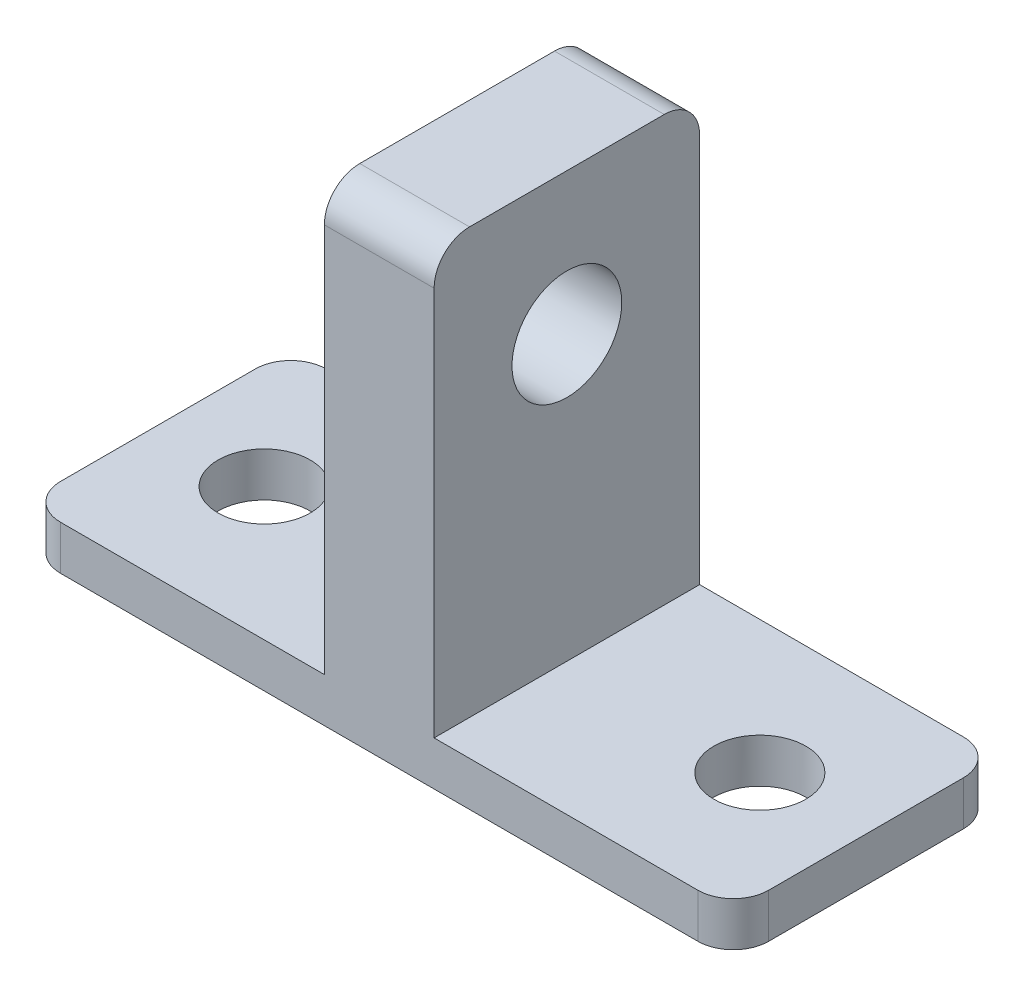
ISO-10303-21;
HEADER;
FILE_DESCRIPTION(('STEP AP214'),'2;1');
FILE_NAME('part.step','',(''),(''),'','','');
FILE_SCHEMA(('AUTOMOTIVE_DESIGN { 1 0 10303 214 1 1 1 1 }'));
ENDSEC;
DATA;
#1=APPLICATION_CONTEXT('core data for automotive mechanical design processes');
#2=APPLICATION_PROTOCOL_DEFINITION('international standard','automotive_design',2000,#1);
#3=PRODUCT_CONTEXT('',#1,'mechanical');
#4=PRODUCT('Part','Part','',(#3));
#5=PRODUCT_RELATED_PRODUCT_CATEGORY('part','',(#4));
#6=PRODUCT_DEFINITION_FORMATION('','',#4);
#7=PRODUCT_DEFINITION_CONTEXT('part definition',#1,'design');
#8=PRODUCT_DEFINITION('design','',#6,#7);
#9=PRODUCT_DEFINITION_SHAPE('','',#8);
#10=(LENGTH_UNIT() NAMED_UNIT(*) SI_UNIT(.MILLI.,.METRE.));
#11=(NAMED_UNIT(*) PLANE_ANGLE_UNIT() SI_UNIT($,.RADIAN.));
#12=(NAMED_UNIT(*) SI_UNIT($,.STERADIAN.) SOLID_ANGLE_UNIT());
#13=UNCERTAINTY_MEASURE_WITH_UNIT(LENGTH_MEASURE(1.E-05),#10,'distance_accuracy_value','');
#14=(GEOMETRIC_REPRESENTATION_CONTEXT(3) GLOBAL_UNCERTAINTY_ASSIGNED_CONTEXT((#13)) GLOBAL_UNIT_ASSIGNED_CONTEXT((#10,
#11,#12)) REPRESENTATION_CONTEXT('',''));
#15=CARTESIAN_POINT('',(0.,0.,0.));
#16=DIRECTION('',(0.,0.,1.));
#17=DIRECTION('',(1.,0.,0.));
#18=AXIS2_PLACEMENT_3D('',#15,#16,#17);
#19=CARTESIAN_POINT('',(0.,3.175,0.));
#20=DIRECTION('',(0.,1.,0.));
#21=DIRECTION('',(0.,0.,1.));
#22=AXIS2_PLACEMENT_3D('',#19,#20,#21);
#23=PLANE('',#22);
#24=CARTESIAN_POINT('',(17.78,3.175,0.));
#25=DIRECTION('',(0.,1.,0.));
#26=DIRECTION('',(0.,0.,1.));
#27=AXIS2_PLACEMENT_3D('',#24,#25,#26);
#28=CIRCLE('',#27,3.302);
#29=CARTESIAN_POINT('',(17.78,3.175,3.302));
#30=VERTEX_POINT('',#29);
#31=EDGE_CURVE('E309',#30,#30,#28,.T.);
#32=ORIENTED_EDGE('',*,*,#31,.F.);
#33=EDGE_LOOP('',(#32));
#34=FACE_BOUND('',#33,.T.);
#35=DIRECTION('',(0.,0.,-1.));
#36=VECTOR('',#35,1.);
#37=CARTESIAN_POINT('',(25.4,3.175,-9.525));
#38=LINE('',#37,#36);
#39=CARTESIAN_POINT('',(25.4,3.175,6.98499999999999));
#40=VERTEX_POINT('',#39);
#41=CARTESIAN_POINT('',(25.4,3.175,-6.985));
#42=VERTEX_POINT('',#41);
#43=EDGE_CURVE('E189',#40,#42,#38,.T.);
#44=ORIENTED_EDGE('',*,*,#43,.T.);
#45=CARTESIAN_POINT('',(22.86,3.175,-6.985));
#46=DIRECTION('',(0.,1.,0.));
#47=DIRECTION('',(0.,0.,1.));
#48=AXIS2_PLACEMENT_3D('',#45,#46,#47);
#49=CIRCLE('',#48,2.54);
#50=CARTESIAN_POINT('',(22.86,3.175,-9.525));
#51=VERTEX_POINT('',#50);
#52=EDGE_CURVE('E11',#42,#51,#49,.T.);
#53=ORIENTED_EDGE('',*,*,#52,.T.);
#54=DIRECTION('',(-1.,0.,0.));
#55=VECTOR('',#54,1.);
#56=CARTESIAN_POINT('',(-25.4,3.175,-9.525));
#57=LINE('',#56,#55);
#58=CARTESIAN_POINT('',(3.937,3.175,-9.525));
#59=VERTEX_POINT('',#58);
#60=EDGE_CURVE('E193',#51,#59,#57,.T.);
#61=ORIENTED_EDGE('',*,*,#60,.T.);
#62=DIRECTION('',(0.,0.,-1.));
#63=VECTOR('',#62,1.);
#64=CARTESIAN_POINT('',(3.937,3.175,-9.525));
#65=LINE('',#64,#63);
#66=CARTESIAN_POINT('',(3.937,3.175,9.525));
#67=VERTEX_POINT('',#66);
#68=EDGE_CURVE('E173',#67,#59,#65,.T.);
#69=ORIENTED_EDGE('',*,*,#68,.F.);
#70=DIRECTION('',(1.,0.,0.));
#71=VECTOR('',#70,1.);
#72=CARTESIAN_POINT('',(-25.4,3.175,9.525));
#73=LINE('',#72,#71);
#74=CARTESIAN_POINT('',(22.86,3.175,9.525));
#75=VERTEX_POINT('',#74);
#76=EDGE_CURVE('E156',#67,#75,#73,.T.);
#77=ORIENTED_EDGE('',*,*,#76,.T.);
#78=CARTESIAN_POINT('',(22.86,3.175,6.985));
#79=DIRECTION('',(0.,1.,0.));
#80=DIRECTION('',(0.,0.,1.));
#81=AXIS2_PLACEMENT_3D('',#78,#79,#80);
#82=CIRCLE('',#81,2.54);
#83=EDGE_CURVE('E49',#75,#40,#82,.T.);
#84=ORIENTED_EDGE('',*,*,#83,.T.);
#85=EDGE_LOOP('',(#44,#53,#61,#69,#77,#84));
#86=FACE_BOUND('',#85,.T.);
#87=ADVANCED_FACE('F41',(#34,#86),#23,.T.);
#88=CARTESIAN_POINT('',(25.4,3.175,-9.525));
#89=DIRECTION('',(-1.,0.,0.));
#90=DIRECTION('',(0.,0.,1.));
#91=AXIS2_PLACEMENT_3D('',#88,#89,#90);
#92=PLANE('',#91);
#93=DIRECTION('',(0.,0.,-1.));
#94=VECTOR('',#93,1.);
#95=CARTESIAN_POINT('',(25.4,0.,-9.525));
#96=LINE('',#95,#94);
#97=CARTESIAN_POINT('',(25.4,0.,6.98499999999999));
#98=VERTEX_POINT('',#97);
#99=CARTESIAN_POINT('',(25.4,0.,-6.985));
#100=VERTEX_POINT('',#99);
#101=EDGE_CURVE('E188',#98,#100,#96,.T.);
#102=ORIENTED_EDGE('',*,*,#101,.T.);
#103=DIRECTION('',(0.,-1.,0.));
#104=VECTOR('',#103,1.);
#105=CARTESIAN_POINT('',(25.4,3.175,-6.985));
#106=LINE('',#105,#104);
#107=EDGE_CURVE('E56',#100,#42,#106,.F.);
#108=ORIENTED_EDGE('',*,*,#107,.T.);
#109=ORIENTED_EDGE('',*,*,#43,.F.);
#110=DIRECTION('',(0.,-1.,0.));
#111=VECTOR('',#110,1.);
#112=CARTESIAN_POINT('',(25.4,3.175,6.985));
#113=LINE('',#112,#111);
#114=EDGE_CURVE('E251',#40,#98,#113,.T.);
#115=ORIENTED_EDGE('',*,*,#114,.T.);
#116=EDGE_LOOP('',(#102,#108,#109,#115));
#117=FACE_BOUND('',#116,.T.);
#118=ADVANCED_FACE('F256',(#117),#92,.F.);
#119=CARTESIAN_POINT('',(-25.4,3.175,-9.525));
#120=DIRECTION('',(0.,0.,1.));
#121=DIRECTION('',(1.,0.,0.));
#122=AXIS2_PLACEMENT_3D('',#119,#120,#121);
#123=PLANE('',#122);
#124=DIRECTION('',(0.,-1.,0.));
#125=VECTOR('',#124,1.);
#126=CARTESIAN_POINT('',(-3.937,33.655,-9.525));
#127=LINE('',#126,#125);
#128=CARTESIAN_POINT('',(-3.937,31.115,-9.525));
#129=VERTEX_POINT('',#128);
#130=CARTESIAN_POINT('',(-3.937,3.175,-9.525));
#131=VERTEX_POINT('',#130);
#132=EDGE_CURVE('E166',#129,#131,#127,.T.);
#133=ORIENTED_EDGE('',*,*,#132,.F.);
#134=DIRECTION('',(-1.,0.,0.));
#135=VECTOR('',#134,1.);
#136=CARTESIAN_POINT('',(3.937,31.115,-9.525));
#137=LINE('',#136,#135);
#138=CARTESIAN_POINT('',(3.937,31.115,-9.525));
#139=VERTEX_POINT('',#138);
#140=EDGE_CURVE('E224',#129,#139,#137,.F.);
#141=ORIENTED_EDGE('',*,*,#140,.T.);
#142=DIRECTION('',(0.,-1.,0.));
#143=VECTOR('',#142,1.);
#144=CARTESIAN_POINT('',(3.937,33.655,-9.525));
#145=LINE('',#144,#143);
#146=EDGE_CURVE('E185',#139,#59,#145,.T.);
#147=ORIENTED_EDGE('',*,*,#146,.T.);
#148=ORIENTED_EDGE('',*,*,#60,.F.);
#149=DIRECTION('',(0.,-1.,0.));
#150=VECTOR('',#149,1.);
#151=CARTESIAN_POINT('',(22.86,3.175,-9.525));
#152=LINE('',#151,#150);
#153=CARTESIAN_POINT('',(22.86,0.,-9.525));
#154=VERTEX_POINT('',#153);
#155=EDGE_CURVE('E219',#51,#154,#152,.T.);
#156=ORIENTED_EDGE('',*,*,#155,.T.);
#157=DIRECTION('',(-1.,0.,0.));
#158=VECTOR('',#157,1.);
#159=CARTESIAN_POINT('',(-25.4,0.,-9.525));
#160=LINE('',#159,#158);
#161=CARTESIAN_POINT('',(-22.86,0.,-9.525));
#162=VERTEX_POINT('',#161);
#163=EDGE_CURVE('E198',#154,#162,#160,.T.);
#164=ORIENTED_EDGE('',*,*,#163,.T.);
#165=DIRECTION('',(0.,-1.,0.));
#166=VECTOR('',#165,1.);
#167=CARTESIAN_POINT('',(-22.86,3.175,-9.525));
#168=LINE('',#167,#166);
#169=CARTESIAN_POINT('',(-22.86,3.175,-9.525));
#170=VERTEX_POINT('',#169);
#171=EDGE_CURVE('E222',#162,#170,#168,.F.);
#172=ORIENTED_EDGE('',*,*,#171,.T.);
#173=EDGE_CURVE('E191',#131,#170,#57,.T.);
#174=ORIENTED_EDGE('',*,*,#173,.F.);
#175=EDGE_LOOP('',(#133,#141,#147,#148,#156,#164,#172,#174));
#176=FACE_BOUND('',#175,.T.);
#177=ADVANCED_FACE('F269',(#176),#123,.F.);
#178=CARTESIAN_POINT('',(-25.4,3.175,-9.525));
#179=DIRECTION('',(1.,0.,0.));
#180=DIRECTION('',(0.,0.,-1.));
#181=AXIS2_PLACEMENT_3D('',#178,#179,#180);
#182=PLANE('',#181);
#183=DIRECTION('',(0.,0.,1.));
#184=VECTOR('',#183,1.);
#185=CARTESIAN_POINT('',(-25.4,3.175,-9.525));
#186=LINE('',#185,#184);
#187=CARTESIAN_POINT('',(-25.4,3.175,-6.985));
#188=VERTEX_POINT('',#187);
#189=CARTESIAN_POINT('',(-25.4,3.175,6.98499999999999));
#190=VERTEX_POINT('',#189);
#191=EDGE_CURVE('E195',#188,#190,#186,.T.);
#192=ORIENTED_EDGE('',*,*,#191,.F.);
#193=DIRECTION('',(0.,-1.,0.));
#194=VECTOR('',#193,1.);
#195=CARTESIAN_POINT('',(-25.4,3.175,-6.985));
#196=LINE('',#195,#194);
#197=CARTESIAN_POINT('',(-25.4,0.,-6.985));
#198=VERTEX_POINT('',#197);
#199=EDGE_CURVE('E237',#188,#198,#196,.T.);
#200=ORIENTED_EDGE('',*,*,#199,.T.);
#201=DIRECTION('',(0.,0.,1.));
#202=VECTOR('',#201,1.);
#203=CARTESIAN_POINT('',(-25.4,0.,-9.525));
#204=LINE('',#203,#202);
#205=CARTESIAN_POINT('',(-25.4,0.,6.98499999999999));
#206=VERTEX_POINT('',#205);
#207=EDGE_CURVE('E201',#198,#206,#204,.T.);
#208=ORIENTED_EDGE('',*,*,#207,.T.);
#209=DIRECTION('',(0.,-1.,0.));
#210=VECTOR('',#209,1.);
#211=CARTESIAN_POINT('',(-25.4,3.175,6.985));
#212=LINE('',#211,#210);
#213=EDGE_CURVE('E235',#206,#190,#212,.F.);
#214=ORIENTED_EDGE('',*,*,#213,.T.);
#215=EDGE_LOOP('',(#192,#200,#208,#214));
#216=FACE_BOUND('',#215,.T.);
#217=ADVANCED_FACE('F304',(#216),#182,.F.);
#218=CARTESIAN_POINT('',(-25.4,3.175,9.525));
#219=DIRECTION('',(0.,0.,-1.));
#220=DIRECTION('',(-1.,0.,0.));
#221=AXIS2_PLACEMENT_3D('',#218,#219,#220);
#222=PLANE('',#221);
#223=DIRECTION('',(0.,-1.,0.));
#224=VECTOR('',#223,1.);
#225=CARTESIAN_POINT('',(3.937,33.655,9.525));
#226=LINE('',#225,#224);
#227=CARTESIAN_POINT('',(3.937,31.115,9.525));
#228=VERTEX_POINT('',#227);
#229=EDGE_CURVE('E167',#228,#67,#226,.T.);
#230=ORIENTED_EDGE('',*,*,#229,.F.);
#231=DIRECTION('',(1.,0.,0.));
#232=VECTOR('',#231,1.);
#233=CARTESIAN_POINT('',(-3.937,31.115,9.525));
#234=LINE('',#233,#232);
#235=CARTESIAN_POINT('',(-3.937,31.115,9.525));
#236=VERTEX_POINT('',#235);
#237=EDGE_CURVE('E163',#228,#236,#234,.F.);
#238=ORIENTED_EDGE('',*,*,#237,.T.);
#239=DIRECTION('',(0.,-1.,0.));
#240=VECTOR('',#239,1.);
#241=CARTESIAN_POINT('',(-3.937,33.655,9.525));
#242=LINE('',#241,#240);
#243=CARTESIAN_POINT('',(-3.937,3.175,9.525));
#244=VERTEX_POINT('',#243);
#245=EDGE_CURVE('E159',#236,#244,#242,.T.);
#246=ORIENTED_EDGE('',*,*,#245,.T.);
#247=CARTESIAN_POINT('',(-22.86,3.175,9.525));
#248=VERTEX_POINT('',#247);
#249=EDGE_CURVE('E142',#248,#244,#73,.T.);
#250=ORIENTED_EDGE('',*,*,#249,.F.);
#251=DIRECTION('',(0.,-1.,0.));
#252=VECTOR('',#251,1.);
#253=CARTESIAN_POINT('',(-22.86,3.175,9.525));
#254=LINE('',#253,#252);
#255=CARTESIAN_POINT('',(-22.86,0.,9.525));
#256=VERTEX_POINT('',#255);
#257=EDGE_CURVE('E230',#248,#256,#254,.T.);
#258=ORIENTED_EDGE('',*,*,#257,.T.);
#259=DIRECTION('',(1.,0.,0.));
#260=VECTOR('',#259,1.);
#261=CARTESIAN_POINT('',(-25.4,0.,9.525));
#262=LINE('',#261,#260);
#263=CARTESIAN_POINT('',(22.86,0.,9.525));
#264=VERTEX_POINT('',#263);
#265=EDGE_CURVE('E192',#256,#264,#262,.T.);
#266=ORIENTED_EDGE('',*,*,#265,.T.);
#267=DIRECTION('',(0.,-1.,0.));
#268=VECTOR('',#267,1.);
#269=CARTESIAN_POINT('',(22.86,3.175,9.525));
#270=LINE('',#269,#268);
#271=EDGE_CURVE('E232',#264,#75,#270,.F.);
#272=ORIENTED_EDGE('',*,*,#271,.T.);
#273=ORIENTED_EDGE('',*,*,#76,.F.);
#274=EDGE_LOOP('',(#230,#238,#246,#250,#258,#266,#272,#273));
#275=FACE_BOUND('',#274,.T.);
#276=ADVANCED_FACE('F161',(#275),#222,.F.);
#277=CARTESIAN_POINT('',(-17.78,3.175,0.));
#278=DIRECTION('',(0.,1.,0.));
#279=DIRECTION('',(0.,0.,1.));
#280=AXIS2_PLACEMENT_3D('',#277,#278,#279);
#281=CIRCLE('',#280,3.302);
#282=CARTESIAN_POINT('',(-17.78,3.175,3.302));
#283=VERTEX_POINT('',#282);
#284=EDGE_CURVE('E209',#283,#283,#281,.T.);
#285=ORIENTED_EDGE('',*,*,#284,.F.);
#286=EDGE_LOOP('',(#285));
#287=FACE_BOUND('',#286,.T.);
#288=ORIENTED_EDGE('',*,*,#173,.T.);
#289=CARTESIAN_POINT('',(-22.86,3.175,-6.985));
#290=DIRECTION('',(0.,1.,0.));
#291=DIRECTION('',(0.,0.,1.));
#292=AXIS2_PLACEMENT_3D('',#289,#290,#291);
#293=CIRCLE('',#292,2.54);
#294=EDGE_CURVE('E249',#170,#188,#293,.T.);
#295=ORIENTED_EDGE('',*,*,#294,.T.);
#296=ORIENTED_EDGE('',*,*,#191,.T.);
#297=CARTESIAN_POINT('',(-22.86,3.175,6.985));
#298=DIRECTION('',(0.,1.,0.));
#299=DIRECTION('',(0.,0.,1.));
#300=AXIS2_PLACEMENT_3D('',#297,#298,#299);
#301=CIRCLE('',#300,2.54);
#302=EDGE_CURVE('E151',#190,#248,#301,.T.);
#303=ORIENTED_EDGE('',*,*,#302,.T.);
#304=ORIENTED_EDGE('',*,*,#249,.T.);
#305=DIRECTION('',(0.,0.,1.));
#306=VECTOR('',#305,1.);
#307=CARTESIAN_POINT('',(-3.937,3.175,-9.525));
#308=LINE('',#307,#306);
#309=EDGE_CURVE('E147',#131,#244,#308,.T.);
#310=ORIENTED_EDGE('',*,*,#309,.F.);
#311=EDGE_LOOP('',(#288,#295,#296,#303,#304,#310));
#312=FACE_BOUND('',#311,.T.);
#313=ADVANCED_FACE('F145',(#287,#312),#23,.T.);
#314=CARTESIAN_POINT('',(0.,0.,0.));
#315=DIRECTION('',(0.,1.,0.));
#316=DIRECTION('',(0.,0.,1.));
#317=AXIS2_PLACEMENT_3D('',#314,#315,#316);
#318=PLANE('',#317);
#319=CARTESIAN_POINT('',(-17.78,0.,0.));
#320=DIRECTION('',(0.,1.,0.));
#321=DIRECTION('',(0.,0.,1.));
#322=AXIS2_PLACEMENT_3D('',#319,#320,#321);
#323=CIRCLE('',#322,3.302);
#324=CARTESIAN_POINT('',(-17.78,0.,3.302));
#325=VERTEX_POINT('',#324);
#326=EDGE_CURVE('E312',#325,#325,#323,.T.);
#327=ORIENTED_EDGE('',*,*,#326,.T.);
#328=EDGE_LOOP('',(#327));
#329=FACE_BOUND('',#328,.T.);
#330=CARTESIAN_POINT('',(17.78,0.,0.));
#331=DIRECTION('',(0.,1.,0.));
#332=DIRECTION('',(0.,0.,-1.));
#333=AXIS2_PLACEMENT_3D('',#330,#331,#332);
#334=CIRCLE('',#333,3.302);
#335=CARTESIAN_POINT('',(17.78,0.,-3.302));
#336=VERTEX_POINT('',#335);
#337=EDGE_CURVE('E482',#336,#336,#334,.T.);
#338=ORIENTED_EDGE('',*,*,#337,.T.);
#339=EDGE_LOOP('',(#338));
#340=FACE_BOUND('',#339,.T.);
#341=ORIENTED_EDGE('',*,*,#207,.F.);
#342=CARTESIAN_POINT('',(-22.86,0.,-6.985));
#343=DIRECTION('',(0.,1.,0.));
#344=DIRECTION('',(0.,0.,1.));
#345=AXIS2_PLACEMENT_3D('',#342,#343,#344);
#346=CIRCLE('',#345,2.54);
#347=EDGE_CURVE('E246',#198,#162,#346,.F.);
#348=ORIENTED_EDGE('',*,*,#347,.T.);
#349=ORIENTED_EDGE('',*,*,#163,.F.);
#350=CARTESIAN_POINT('',(22.86,0.,-6.985));
#351=DIRECTION('',(0.,1.,0.));
#352=DIRECTION('',(0.,0.,1.));
#353=AXIS2_PLACEMENT_3D('',#350,#351,#352);
#354=CIRCLE('',#353,2.54);
#355=EDGE_CURVE('E244',#154,#100,#354,.F.);
#356=ORIENTED_EDGE('',*,*,#355,.T.);
#357=ORIENTED_EDGE('',*,*,#101,.F.);
#358=CARTESIAN_POINT('',(22.86,0.,6.985));
#359=DIRECTION('',(0.,1.,0.));
#360=DIRECTION('',(0.,0.,1.));
#361=AXIS2_PLACEMENT_3D('',#358,#359,#360);
#362=CIRCLE('',#361,2.54);
#363=EDGE_CURVE('E242',#98,#264,#362,.F.);
#364=ORIENTED_EDGE('',*,*,#363,.T.);
#365=ORIENTED_EDGE('',*,*,#265,.F.);
#366=CARTESIAN_POINT('',(-22.86,0.,6.985));
#367=DIRECTION('',(0.,1.,0.));
#368=DIRECTION('',(0.,0.,1.));
#369=AXIS2_PLACEMENT_3D('',#366,#367,#368);
#370=CIRCLE('',#369,2.54);
#371=EDGE_CURVE('E240',#256,#206,#370,.F.);
#372=ORIENTED_EDGE('',*,*,#371,.T.);
#373=EDGE_LOOP('',(#341,#348,#349,#356,#357,#364,#365,#372));
#374=FACE_BOUND('',#373,.T.);
#375=ADVANCED_FACE('F260',(#329,#340,#374),#318,.F.);
#376=CARTESIAN_POINT('',(3.937,33.655,-9.525));
#377=DIRECTION('',(-1.,0.,0.));
#378=DIRECTION('',(0.,0.,1.));
#379=AXIS2_PLACEMENT_3D('',#376,#377,#378);
#380=PLANE('',#379);
#381=CARTESIAN_POINT('',(3.937,23.495,0.));
#382=DIRECTION('',(-1.,0.,0.));
#383=DIRECTION('',(0.,0.,1.));
#384=AXIS2_PLACEMENT_3D('',#381,#382,#383);
#385=CIRCLE('',#384,3.937);
#386=CARTESIAN_POINT('',(3.937,23.495,-3.937));
#387=VERTEX_POINT('',#386);
#388=EDGE_CURVE('E179',#387,#387,#385,.T.);
#389=ORIENTED_EDGE('',*,*,#388,.T.);
#390=EDGE_LOOP('',(#389));
#391=FACE_BOUND('',#390,.T.);
#392=ORIENTED_EDGE('',*,*,#146,.F.);
#393=CARTESIAN_POINT('',(3.937,31.115,-6.985));
#394=DIRECTION('',(-1.,0.,0.));
#395=DIRECTION('',(0.,0.,1.));
#396=AXIS2_PLACEMENT_3D('',#393,#394,#395);
#397=CIRCLE('',#396,2.54);
#398=CARTESIAN_POINT('',(3.937,33.655,-6.985));
#399=VERTEX_POINT('',#398);
#400=EDGE_CURVE('E228',#139,#399,#397,.F.);
#401=ORIENTED_EDGE('',*,*,#400,.T.);
#402=DIRECTION('',(0.,0.,-1.));
#403=VECTOR('',#402,1.);
#404=CARTESIAN_POINT('',(3.937,33.655,-9.525));
#405=LINE('',#404,#403);
#406=CARTESIAN_POINT('',(3.937,33.655,6.98499999999999));
#407=VERTEX_POINT('',#406);
#408=EDGE_CURVE('E172',#407,#399,#405,.T.);
#409=ORIENTED_EDGE('',*,*,#408,.F.);
#410=CARTESIAN_POINT('',(3.937,31.115,6.985));
#411=DIRECTION('',(-1.,0.,0.));
#412=DIRECTION('',(0.,0.,1.));
#413=AXIS2_PLACEMENT_3D('',#410,#411,#412);
#414=CIRCLE('',#413,2.54);
#415=EDGE_CURVE('E226',#407,#228,#414,.F.);
#416=ORIENTED_EDGE('',*,*,#415,.T.);
#417=ORIENTED_EDGE('',*,*,#229,.T.);
#418=ORIENTED_EDGE('',*,*,#68,.T.);
#419=EDGE_LOOP('',(#392,#401,#409,#416,#417,#418));
#420=FACE_BOUND('',#419,.T.);
#421=ADVANCED_FACE('F302',(#391,#420),#380,.F.);
#422=CARTESIAN_POINT('',(-3.937,33.655,-9.525));
#423=DIRECTION('',(1.,0.,0.));
#424=DIRECTION('',(0.,0.,-1.));
#425=AXIS2_PLACEMENT_3D('',#422,#423,#424);
#426=PLANE('',#425);
#427=CARTESIAN_POINT('',(-3.937,23.495,0.));
#428=DIRECTION('',(1.,0.,0.));
#429=DIRECTION('',(0.,0.,-1.));
#430=AXIS2_PLACEMENT_3D('',#427,#428,#429);
#431=CIRCLE('',#430,3.937);
#432=CARTESIAN_POINT('',(-3.937,23.495,-3.937));
#433=VERTEX_POINT('',#432);
#434=EDGE_CURVE('E206',#433,#433,#431,.T.);
#435=ORIENTED_EDGE('',*,*,#434,.T.);
#436=EDGE_LOOP('',(#435));
#437=FACE_BOUND('',#436,.T.);
#438=DIRECTION('',(0.,0.,1.));
#439=VECTOR('',#438,1.);
#440=CARTESIAN_POINT('',(-3.937,33.655,-9.525));
#441=LINE('',#440,#439);
#442=CARTESIAN_POINT('',(-3.937,33.655,-6.985));
#443=VERTEX_POINT('',#442);
#444=CARTESIAN_POINT('',(-3.937,33.655,6.98499999999999));
#445=VERTEX_POINT('',#444);
#446=EDGE_CURVE('E176',#443,#445,#441,.T.);
#447=ORIENTED_EDGE('',*,*,#446,.F.);
#448=CARTESIAN_POINT('',(-3.937,31.115,-6.985));
#449=DIRECTION('',(1.,0.,0.));
#450=DIRECTION('',(0.,0.,-1.));
#451=AXIS2_PLACEMENT_3D('',#448,#449,#450);
#452=CIRCLE('',#451,2.54);
#453=EDGE_CURVE('E217',#443,#129,#452,.F.);
#454=ORIENTED_EDGE('',*,*,#453,.T.);
#455=ORIENTED_EDGE('',*,*,#132,.T.);
#456=ORIENTED_EDGE('',*,*,#309,.T.);
#457=ORIENTED_EDGE('',*,*,#245,.F.);
#458=CARTESIAN_POINT('',(-3.937,31.115,6.985));
#459=DIRECTION('',(1.,0.,0.));
#460=DIRECTION('',(0.,0.,-1.));
#461=AXIS2_PLACEMENT_3D('',#458,#459,#460);
#462=CIRCLE('',#461,2.54);
#463=EDGE_CURVE('E215',#236,#445,#462,.F.);
#464=ORIENTED_EDGE('',*,*,#463,.T.);
#465=EDGE_LOOP('',(#447,#454,#455,#456,#457,#464));
#466=FACE_BOUND('',#465,.T.);
#467=ADVANCED_FACE('F170',(#437,#466),#426,.F.);
#468=CARTESIAN_POINT('',(0.,33.655,0.));
#469=DIRECTION('',(0.,1.,0.));
#470=DIRECTION('',(0.,0.,1.));
#471=AXIS2_PLACEMENT_3D('',#468,#469,#470);
#472=PLANE('',#471);
#473=ORIENTED_EDGE('',*,*,#408,.T.);
#474=DIRECTION('',(-1.,0.,0.));
#475=VECTOR('',#474,1.);
#476=CARTESIAN_POINT('',(-3.937,33.655,-6.985));
#477=LINE('',#476,#475);
#478=EDGE_CURVE('E212',#399,#443,#477,.T.);
#479=ORIENTED_EDGE('',*,*,#478,.T.);
#480=ORIENTED_EDGE('',*,*,#446,.T.);
#481=DIRECTION('',(1.,0.,0.));
#482=VECTOR('',#481,1.);
#483=CARTESIAN_POINT('',(3.937,33.655,6.985));
#484=LINE('',#483,#482);
#485=EDGE_CURVE('E155',#445,#407,#484,.T.);
#486=ORIENTED_EDGE('',*,*,#485,.T.);
#487=EDGE_LOOP('',(#473,#479,#480,#486));
#488=FACE_BOUND('',#487,.T.);
#489=ADVANCED_FACE('F320',(#488),#472,.T.);
#490=CARTESIAN_POINT('',(-25.4,23.495,0.));
#491=DIRECTION('',(1.,0.,0.));
#492=DIRECTION('',(0.,0.,-1.));
#493=AXIS2_PLACEMENT_3D('',#490,#491,#492);
#494=CYLINDRICAL_SURFACE('',#493,3.937);
#495=CARTESIAN_POINT('',(-3.937,23.495,-3.937));
#496=CARTESIAN_POINT('',(-3.85497916666667,23.495,-3.937));
#497=CARTESIAN_POINT('',(-3.77295833333333,23.495,-3.937));
#498=CARTESIAN_POINT('',(-3.60891666666667,23.495,-3.937));
#499=CARTESIAN_POINT('',(-3.52689583333333,23.495,-3.937));
#500=CARTESIAN_POINT('',(-3.36285416666667,23.495,-3.937));
#501=CARTESIAN_POINT('',(-3.28083333333333,23.495,-3.937));
#502=CARTESIAN_POINT('',(-3.11679166666667,23.495,-3.937));
#503=CARTESIAN_POINT('',(-3.03477083333333,23.495,-3.937));
#504=CARTESIAN_POINT('',(-2.87072916666667,23.495,-3.937));
#505=CARTESIAN_POINT('',(-2.78870833333333,23.495,-3.937));
#506=CARTESIAN_POINT('',(-2.62466666666667,23.495,-3.937));
#507=CARTESIAN_POINT('',(-2.54264583333333,23.495,-3.937));
#508=CARTESIAN_POINT('',(-2.37860416666667,23.495,-3.937));
#509=CARTESIAN_POINT('',(-2.29658333333333,23.495,-3.937));
#510=CARTESIAN_POINT('',(-2.13254166666667,23.495,-3.937));
#511=CARTESIAN_POINT('',(-2.05052083333333,23.495,-3.937));
#512=CARTESIAN_POINT('',(-1.88647916666667,23.495,-3.937));
#513=CARTESIAN_POINT('',(-1.80445833333333,23.495,-3.937));
#514=CARTESIAN_POINT('',(-1.64041666666667,23.495,-3.937));
#515=CARTESIAN_POINT('',(-1.55839583333333,23.495,-3.937));
#516=CARTESIAN_POINT('',(-1.39435416666667,23.495,-3.937));
#517=CARTESIAN_POINT('',(-1.31233333333333,23.495,-3.937));
#518=CARTESIAN_POINT('',(-1.14829166666667,23.495,-3.937));
#519=CARTESIAN_POINT('',(-1.06627083333333,23.495,-3.937));
#520=CARTESIAN_POINT('',(-0.902229166666666,23.495,-3.937));
#521=CARTESIAN_POINT('',(-0.820208333333334,23.495,-3.937));
#522=CARTESIAN_POINT('',(-0.656166666666667,23.495,-3.937));
#523=CARTESIAN_POINT('',(-0.574145833333333,23.495,-3.937));
#524=CARTESIAN_POINT('',(-0.410104166666667,23.495,-3.937));
#525=CARTESIAN_POINT('',(-0.328083333333334,23.495,-3.937));
#526=CARTESIAN_POINT('',(-0.164041666666668,23.495,-3.937));
#527=CARTESIAN_POINT('',(-0.0820208333333338,23.495,-3.937));
#528=CARTESIAN_POINT('',(0.0820208333333338,23.495,-3.937));
#529=CARTESIAN_POINT('',(0.164041666666668,23.495,-3.937));
#530=CARTESIAN_POINT('',(0.328083333333334,23.495,-3.937));
#531=CARTESIAN_POINT('',(0.410104166666667,23.495,-3.937));
#532=CARTESIAN_POINT('',(0.574145833333333,23.495,-3.937));
#533=CARTESIAN_POINT('',(0.656166666666667,23.495,-3.937));
#534=CARTESIAN_POINT('',(0.820208333333334,23.495,-3.937));
#535=CARTESIAN_POINT('',(0.902229166666666,23.495,-3.937));
#536=CARTESIAN_POINT('',(1.06627083333333,23.495,-3.937));
#537=CARTESIAN_POINT('',(1.14829166666667,23.495,-3.937));
#538=CARTESIAN_POINT('',(1.31233333333333,23.495,-3.937));
#539=CARTESIAN_POINT('',(1.39435416666667,23.495,-3.937));
#540=CARTESIAN_POINT('',(1.55839583333333,23.495,-3.937));
#541=CARTESIAN_POINT('',(1.64041666666667,23.495,-3.937));
#542=CARTESIAN_POINT('',(1.80445833333333,23.495,-3.937));
#543=CARTESIAN_POINT('',(1.88647916666667,23.495,-3.937));
#544=CARTESIAN_POINT('',(2.05052083333333,23.495,-3.937));
#545=CARTESIAN_POINT('',(2.13254166666667,23.495,-3.937));
#546=CARTESIAN_POINT('',(2.29658333333333,23.495,-3.937));
#547=CARTESIAN_POINT('',(2.37860416666666,23.495,-3.937));
#548=CARTESIAN_POINT('',(2.54264583333333,23.495,-3.937));
#549=CARTESIAN_POINT('',(2.62466666666667,23.495,-3.937));
#550=CARTESIAN_POINT('',(2.78870833333333,23.495,-3.937));
#551=CARTESIAN_POINT('',(2.87072916666667,23.495,-3.937));
#552=CARTESIAN_POINT('',(3.03477083333333,23.495,-3.937));
#553=CARTESIAN_POINT('',(3.11679166666667,23.495,-3.937));
#554=CARTESIAN_POINT('',(3.28083333333333,23.495,-3.937));
#555=CARTESIAN_POINT('',(3.36285416666667,23.495,-3.937));
#556=CARTESIAN_POINT('',(3.52689583333333,23.495,-3.937));
#557=CARTESIAN_POINT('',(3.60891666666667,23.495,-3.937));
#558=CARTESIAN_POINT('',(3.77295833333333,23.495,-3.937));
#559=CARTESIAN_POINT('',(3.85497916666667,23.495,-3.937));
#560=CARTESIAN_POINT('',(3.937,23.495,-3.937));
#561=B_SPLINE_CURVE_WITH_KNOTS('',3,(#495,#496,#497,#498,#499,#500,#501,#502,#503,#504,#505,
#506,#507,#508,#509,#510,#511,#512,#513,#514,#515,#516,#517,#518,#519,#520,#521,#522,#523,#524,
#525,#526,#527,#528,#529,#530,#531,#532,#533,#534,#535,#536,#537,#538,#539,#540,#541,#542,#543,
#544,#545,#546,#547,#548,#549,#550,#551,#552,#553,#554,#555,#556,#557,#558,#559,#560),
.UNSPECIFIED.,.F.,.F.,(4,2,2,2,2,2,2,2,2,2,2,2,2,2,2,2,2,2,2,2,2,2,2,2,2,2,2,2,2,2,2,2,4),(0.,
0.246062500000001,0.492124999999999,0.738187500000001,0.984249999999999,1.2303125,1.476375,
1.7224375,1.9685,2.2145625,2.460625,2.7066875,2.95275,3.1988125,3.444875,3.6909375,3.937,
4.1830625,4.429125,4.6751875,4.92125,5.1673125,5.413375,5.6594375,5.9055,6.1515625,6.397625,
6.6436875,6.88975,7.1358125,7.381875,7.6279375,7.874),.UNSPECIFIED.);
#562=EDGE_CURVE('BSEAM393',#433,#387,#561,.T.);
#563=ORIENTED_EDGE('',*,*,#434,.F.);
#564=ORIENTED_EDGE('',*,*,#388,.F.);
#565=ORIENTED_EDGE('',*,*,#562,.T.);
#566=ORIENTED_EDGE('',*,*,#562,.F.);
#567=EDGE_LOOP('',(#563,#565,#564,#566));
#568=FACE_BOUND('',#567,.T.);
#569=ADVANCED_FACE('F393',(#568),#494,.F.);
#570=CARTESIAN_POINT('',(17.78,0.,0.));
#571=DIRECTION('',(0.,1.,0.));
#572=DIRECTION('',(0.,0.,1.));
#573=AXIS2_PLACEMENT_3D('',#570,#571,#572);
#574=CYLINDRICAL_SURFACE('',#573,3.302);
#575=ORIENTED_EDGE('',*,*,#31,.T.);
#576=EDGE_LOOP('',(#575));
#577=FACE_BOUND('',#576,.T.);
#578=ORIENTED_EDGE('',*,*,#337,.F.);
#579=EDGE_LOOP('',(#578));
#580=FACE_BOUND('',#579,.T.);
#581=ADVANCED_FACE('F385',(#577,#580),#574,.F.);
#582=CARTESIAN_POINT('',(-17.78,0.,0.));
#583=DIRECTION('',(0.,1.,0.));
#584=DIRECTION('',(0.,0.,1.));
#585=AXIS2_PLACEMENT_3D('',#582,#583,#584);
#586=CYLINDRICAL_SURFACE('',#585,3.302);
#587=ORIENTED_EDGE('',*,*,#284,.T.);
#588=EDGE_LOOP('',(#587));
#589=FACE_BOUND('',#588,.T.);
#590=ORIENTED_EDGE('',*,*,#326,.F.);
#591=EDGE_LOOP('',(#590));
#592=FACE_BOUND('',#591,.T.);
#593=ADVANCED_FACE('F344',(#589,#592),#586,.F.);
#594=CARTESIAN_POINT('',(0.,31.115,-6.985));
#595=DIRECTION('',(1.,0.,0.));
#596=DIRECTION('',(0.,0.,-1.));
#597=AXIS2_PLACEMENT_3D('',#594,#595,#596);
#598=CYLINDRICAL_SURFACE('',#597,2.54);
#599=ORIENTED_EDGE('',*,*,#400,.F.);
#600=ORIENTED_EDGE('',*,*,#140,.F.);
#601=ORIENTED_EDGE('',*,*,#453,.F.);
#602=ORIENTED_EDGE('',*,*,#478,.F.);
#603=EDGE_LOOP('',(#599,#600,#601,#602));
#604=FACE_BOUND('',#603,.T.);
#605=ADVANCED_FACE('F327',(#604),#598,.T.);
#606=CARTESIAN_POINT('',(0.,31.115,6.985));
#607=DIRECTION('',(-1.,0.,0.));
#608=DIRECTION('',(0.,0.,1.));
#609=AXIS2_PLACEMENT_3D('',#606,#607,#608);
#610=CYLINDRICAL_SURFACE('',#609,2.54);
#611=ORIENTED_EDGE('',*,*,#463,.F.);
#612=ORIENTED_EDGE('',*,*,#237,.F.);
#613=ORIENTED_EDGE('',*,*,#415,.F.);
#614=ORIENTED_EDGE('',*,*,#485,.F.);
#615=EDGE_LOOP('',(#611,#612,#613,#614));
#616=FACE_BOUND('',#615,.T.);
#617=ADVANCED_FACE('F324',(#616),#610,.T.);
#618=CARTESIAN_POINT('',(-22.86,3.175,-6.985));
#619=DIRECTION('',(0.,-1.,0.));
#620=DIRECTION('',(0.,0.,-1.));
#621=AXIS2_PLACEMENT_3D('',#618,#619,#620);
#622=CYLINDRICAL_SURFACE('',#621,2.54);
#623=ORIENTED_EDGE('',*,*,#294,.F.);
#624=ORIENTED_EDGE('',*,*,#171,.F.);
#625=ORIENTED_EDGE('',*,*,#347,.F.);
#626=ORIENTED_EDGE('',*,*,#199,.F.);
#627=EDGE_LOOP('',(#623,#624,#625,#626));
#628=FACE_BOUND('',#627,.T.);
#629=ADVANCED_FACE('F283',(#628),#622,.T.);
#630=CARTESIAN_POINT('',(22.86,3.175,-6.985));
#631=DIRECTION('',(0.,-1.,0.));
#632=DIRECTION('',(0.,0.,-1.));
#633=AXIS2_PLACEMENT_3D('',#630,#631,#632);
#634=CYLINDRICAL_SURFACE('',#633,2.54);
#635=ORIENTED_EDGE('',*,*,#52,.F.);
#636=ORIENTED_EDGE('',*,*,#107,.F.);
#637=ORIENTED_EDGE('',*,*,#355,.F.);
#638=ORIENTED_EDGE('',*,*,#155,.F.);
#639=EDGE_LOOP('',(#635,#636,#637,#638));
#640=FACE_BOUND('',#639,.T.);
#641=ADVANCED_FACE('F266',(#640),#634,.T.);
#642=CARTESIAN_POINT('',(22.86,3.175,6.985));
#643=DIRECTION('',(0.,-1.,0.));
#644=DIRECTION('',(0.,0.,-1.));
#645=AXIS2_PLACEMENT_3D('',#642,#643,#644);
#646=CYLINDRICAL_SURFACE('',#645,2.54);
#647=ORIENTED_EDGE('',*,*,#83,.F.);
#648=ORIENTED_EDGE('',*,*,#271,.F.);
#649=ORIENTED_EDGE('',*,*,#363,.F.);
#650=ORIENTED_EDGE('',*,*,#114,.F.);
#651=EDGE_LOOP('',(#647,#648,#649,#650));
#652=FACE_BOUND('',#651,.T.);
#653=ADVANCED_FACE('F276',(#652),#646,.T.);
#654=CARTESIAN_POINT('',(-22.86,3.175,6.985));
#655=DIRECTION('',(0.,-1.,0.));
#656=DIRECTION('',(0.,0.,-1.));
#657=AXIS2_PLACEMENT_3D('',#654,#655,#656);
#658=CYLINDRICAL_SURFACE('',#657,2.54);
#659=ORIENTED_EDGE('',*,*,#302,.F.);
#660=ORIENTED_EDGE('',*,*,#213,.F.);
#661=ORIENTED_EDGE('',*,*,#371,.F.);
#662=ORIENTED_EDGE('',*,*,#257,.F.);
#663=EDGE_LOOP('',(#659,#660,#661,#662));
#664=FACE_BOUND('',#663,.T.);
#665=ADVANCED_FACE('F43',(#664),#658,.T.);
#666=CLOSED_SHELL('',(#87,#118,#177,#217,#276,#313,#375,#421,#467,#489,#569,#581,#593,#605,#617,
#629,#641,#653,#665));
#667=MANIFOLD_SOLID_BREP('B2',#666);
#668=ADVANCED_BREP_SHAPE_REPRESENTATION('',(#18,#667),#14);
#669=SHAPE_DEFINITION_REPRESENTATION(#9,#668);
ENDSEC;
END-ISO-10303-21;
